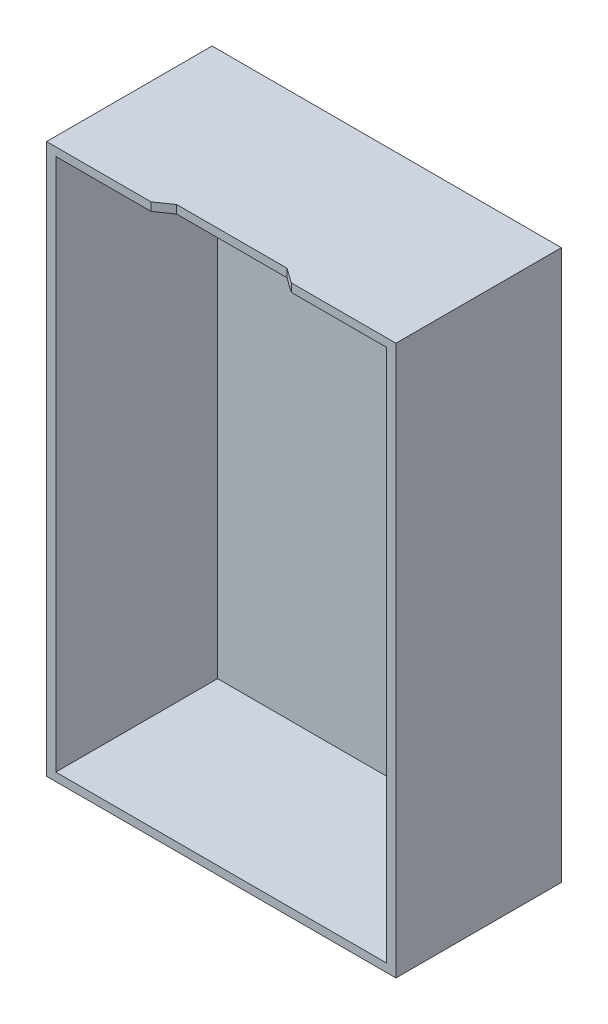
ISO-10303-21;
HEADER;
FILE_DESCRIPTION(('STEP AP214'),'2;1');
FILE_NAME('part.step','',(''),(''),'','','');
FILE_SCHEMA(('AUTOMOTIVE_DESIGN { 1 0 10303 214 1 1 1 1 }'));
ENDSEC;
DATA;
#1=APPLICATION_CONTEXT('core data for automotive mechanical design processes');
#2=APPLICATION_PROTOCOL_DEFINITION('international standard','automotive_design',2000,#1);
#3=PRODUCT_CONTEXT('',#1,'mechanical');
#4=PRODUCT('Part','Part','',(#3));
#5=PRODUCT_RELATED_PRODUCT_CATEGORY('part','',(#4));
#6=PRODUCT_DEFINITION_FORMATION('','',#4);
#7=PRODUCT_DEFINITION_CONTEXT('part definition',#1,'design');
#8=PRODUCT_DEFINITION('design','',#6,#7);
#9=PRODUCT_DEFINITION_SHAPE('','',#8);
#10=(LENGTH_UNIT() NAMED_UNIT(*) SI_UNIT(.MILLI.,.METRE.));
#11=(NAMED_UNIT(*) PLANE_ANGLE_UNIT() SI_UNIT($,.RADIAN.));
#12=(NAMED_UNIT(*) SI_UNIT($,.STERADIAN.) SOLID_ANGLE_UNIT());
#13=UNCERTAINTY_MEASURE_WITH_UNIT(LENGTH_MEASURE(1.E-05),#10,'distance_accuracy_value','');
#14=(GEOMETRIC_REPRESENTATION_CONTEXT(3) GLOBAL_UNCERTAINTY_ASSIGNED_CONTEXT((#13)) GLOBAL_UNIT_ASSIGNED_CONTEXT((#10,
#11,#12)) REPRESENTATION_CONTEXT('',''));
#15=CARTESIAN_POINT('',(0.,0.,0.));
#16=DIRECTION('',(0.,0.,1.));
#17=DIRECTION('',(1.,0.,0.));
#18=AXIS2_PLACEMENT_3D('',#15,#16,#17);
#19=CARTESIAN_POINT('',(120.65,379.73,-57.15));
#20=DIRECTION('',(-1.,0.,0.));
#21=DIRECTION('',(0.,0.,1.));
#22=AXIS2_PLACEMENT_3D('',#19,#20,#21);
#23=PLANE('',#22);
#24=DIRECTION('',(0.,0.,-1.));
#25=VECTOR('',#24,1.);
#26=CARTESIAN_POINT('',(120.65,0.,-57.15));
#27=LINE('',#26,#25);
#28=CARTESIAN_POINT('',(120.65,0.,57.15));
#29=VERTEX_POINT('',#28);
#30=CARTESIAN_POINT('',(120.65,0.,-57.15));
#31=VERTEX_POINT('',#30);
#32=EDGE_CURVE('E166',#29,#31,#27,.T.);
#33=ORIENTED_EDGE('',*,*,#32,.T.);
#34=DIRECTION('',(0.,-1.,0.));
#35=VECTOR('',#34,1.);
#36=CARTESIAN_POINT('',(120.65,379.73,-57.15));
#37=LINE('',#36,#35);
#38=CARTESIAN_POINT('',(120.65,379.73,-57.15));
#39=VERTEX_POINT('',#38);
#40=EDGE_CURVE('E191',#39,#31,#37,.T.);
#41=ORIENTED_EDGE('',*,*,#40,.F.);
#42=DIRECTION('',(0.,0.,-1.));
#43=VECTOR('',#42,1.);
#44=CARTESIAN_POINT('',(120.65,379.73,-57.15));
#45=LINE('',#44,#43);
#46=CARTESIAN_POINT('',(120.65,379.73,57.15));
#47=VERTEX_POINT('',#46);
#48=EDGE_CURVE('E180',#47,#39,#45,.T.);
#49=ORIENTED_EDGE('',*,*,#48,.F.);
#50=DIRECTION('',(0.,-1.,0.));
#51=VECTOR('',#50,1.);
#52=CARTESIAN_POINT('',(120.65,379.73,57.15));
#53=LINE('',#52,#51);
#54=EDGE_CURVE('E153',#47,#29,#53,.T.);
#55=ORIENTED_EDGE('',*,*,#54,.T.);
#56=EDGE_LOOP('',(#33,#41,#49,#55));
#57=FACE_BOUND('',#56,.T.);
#58=ADVANCED_FACE('F39',(#57),#23,.F.);
#59=CARTESIAN_POINT('',(-120.65,379.73,-57.15));
#60=DIRECTION('',(0.,0.,1.));
#61=DIRECTION('',(1.,0.,0.));
#62=AXIS2_PLACEMENT_3D('',#59,#60,#61);
#63=PLANE('',#62);
#64=DIRECTION('',(-1.,0.,0.));
#65=VECTOR('',#64,1.);
#66=CARTESIAN_POINT('',(-120.65,0.,-57.15));
#67=LINE('',#66,#65);
#68=CARTESIAN_POINT('',(-120.65,0.,-57.15));
#69=VERTEX_POINT('',#68);
#70=EDGE_CURVE('E170',#31,#69,#67,.T.);
#71=ORIENTED_EDGE('',*,*,#70,.T.);
#72=DIRECTION('',(0.,-1.,0.));
#73=VECTOR('',#72,1.);
#74=CARTESIAN_POINT('',(-120.65,379.73,-57.15));
#75=LINE('',#74,#73);
#76=CARTESIAN_POINT('',(-120.65,379.73,-57.15));
#77=VERTEX_POINT('',#76);
#78=EDGE_CURVE('E187',#77,#69,#75,.T.);
#79=ORIENTED_EDGE('',*,*,#78,.F.);
#80=DIRECTION('',(-1.,0.,0.));
#81=VECTOR('',#80,1.);
#82=CARTESIAN_POINT('',(-120.65,379.73,-57.15));
#83=LINE('',#82,#81);
#84=EDGE_CURVE('E162',#39,#77,#83,.T.);
#85=ORIENTED_EDGE('',*,*,#84,.F.);
#86=ORIENTED_EDGE('',*,*,#40,.T.);
#87=EDGE_LOOP('',(#71,#79,#85,#86));
#88=FACE_BOUND('',#87,.T.);
#89=ADVANCED_FACE('F264',(#88),#63,.F.);
#90=CARTESIAN_POINT('',(-120.65,379.73,-57.15));
#91=DIRECTION('',(1.,0.,0.));
#92=DIRECTION('',(0.,0.,-1.));
#93=AXIS2_PLACEMENT_3D('',#90,#91,#92);
#94=PLANE('',#93);
#95=DIRECTION('',(0.,0.,1.));
#96=VECTOR('',#95,1.);
#97=CARTESIAN_POINT('',(-120.65,0.,-57.15));
#98=LINE('',#97,#96);
#99=CARTESIAN_POINT('',(-120.65,0.,57.15));
#100=VERTEX_POINT('',#99);
#101=EDGE_CURVE('E174',#69,#100,#98,.T.);
#102=ORIENTED_EDGE('',*,*,#101,.T.);
#103=DIRECTION('',(0.,-1.,0.));
#104=VECTOR('',#103,1.);
#105=CARTESIAN_POINT('',(-120.65,379.73,57.15));
#106=LINE('',#105,#104);
#107=CARTESIAN_POINT('',(-120.65,379.73,57.15));
#108=VERTEX_POINT('',#107);
#109=EDGE_CURVE('E183',#108,#100,#106,.T.);
#110=ORIENTED_EDGE('',*,*,#109,.F.);
#111=DIRECTION('',(0.,0.,1.));
#112=VECTOR('',#111,1.);
#113=CARTESIAN_POINT('',(-120.65,379.73,-57.15));
#114=LINE('',#113,#112);
#115=EDGE_CURVE('E157',#77,#108,#114,.T.);
#116=ORIENTED_EDGE('',*,*,#115,.F.);
#117=ORIENTED_EDGE('',*,*,#78,.T.);
#118=EDGE_LOOP('',(#102,#110,#116,#117));
#119=FACE_BOUND('',#118,.T.);
#120=ADVANCED_FACE('F267',(#119),#94,.F.);
#121=CARTESIAN_POINT('',(-120.65,379.73,57.15));
#122=DIRECTION('',(0.,0.,-1.));
#123=DIRECTION('',(-1.,0.,0.));
#124=AXIS2_PLACEMENT_3D('',#121,#122,#123);
#125=PLANE('',#124);
#126=DIRECTION('',(-1.,0.,0.));
#127=VECTOR('',#126,1.);
#128=CARTESIAN_POINT('',(-114.3,374.015,57.15));
#129=LINE('',#128,#127);
#130=CARTESIAN_POINT('',(-48.5109019290271,374.015,57.15));
#131=VERTEX_POINT('',#130);
#132=CARTESIAN_POINT('',(-114.3,374.015,57.15));
#133=VERTEX_POINT('',#132);
#134=EDGE_CURVE('E235',#131,#133,#129,.T.);
#135=ORIENTED_EDGE('',*,*,#134,.F.);
#136=DIRECTION('',(0.,1.,0.));
#137=VECTOR('',#136,1.);
#138=CARTESIAN_POINT('',(-48.5109019290271,267.97,57.15));
#139=LINE('',#138,#137);
#140=CARTESIAN_POINT('',(-48.5109019290271,379.73,57.15));
#141=VERTEX_POINT('',#140);
#142=EDGE_CURVE('E206',#131,#141,#139,.T.);
#143=ORIENTED_EDGE('',*,*,#142,.T.);
#144=DIRECTION('',(1.,0.,0.));
#145=VECTOR('',#144,1.);
#146=CARTESIAN_POINT('',(-120.65,379.73,57.15));
#147=LINE('',#146,#145);
#148=EDGE_CURVE('E156',#108,#141,#147,.T.);
#149=ORIENTED_EDGE('',*,*,#148,.F.);
#150=ORIENTED_EDGE('',*,*,#109,.T.);
#151=DIRECTION('',(1.,0.,0.));
#152=VECTOR('',#151,1.);
#153=CARTESIAN_POINT('',(-120.65,0.,57.15));
#154=LINE('',#153,#152);
#155=EDGE_CURVE('E177',#100,#29,#154,.T.);
#156=ORIENTED_EDGE('',*,*,#155,.T.);
#157=ORIENTED_EDGE('',*,*,#54,.F.);
#158=CARTESIAN_POINT('',(48.3847974942099,379.73,57.15));
#159=VERTEX_POINT('',#158);
#160=EDGE_CURVE('E144',#159,#47,#147,.T.);
#161=ORIENTED_EDGE('',*,*,#160,.F.);
#162=DIRECTION('',(0.,1.,0.));
#163=VECTOR('',#162,1.);
#164=CARTESIAN_POINT('',(48.3847974942099,267.97,57.15));
#165=LINE('',#164,#163);
#166=CARTESIAN_POINT('',(48.3847974942099,374.015,57.15));
#167=VERTEX_POINT('',#166);
#168=EDGE_CURVE('E126',#167,#159,#165,.T.);
#169=ORIENTED_EDGE('',*,*,#168,.F.);
#170=CARTESIAN_POINT('',(114.3,374.015,57.15));
#171=VERTEX_POINT('',#170);
#172=EDGE_CURVE('E236',#171,#167,#129,.T.);
#173=ORIENTED_EDGE('',*,*,#172,.F.);
#174=DIRECTION('',(0.,1.,0.));
#175=VECTOR('',#174,1.);
#176=CARTESIAN_POINT('',(114.3,374.015,57.15));
#177=LINE('',#176,#175);
#178=CARTESIAN_POINT('',(114.3,5.71499999999994,57.15));
#179=VERTEX_POINT('',#178);
#180=EDGE_CURVE('E62',#179,#171,#177,.T.);
#181=ORIENTED_EDGE('',*,*,#180,.F.);
#182=DIRECTION('',(1.,0.,0.));
#183=VECTOR('',#182,1.);
#184=CARTESIAN_POINT('',(-114.3,5.71499999999994,57.15));
#185=LINE('',#184,#183);
#186=CARTESIAN_POINT('',(-114.3,5.71499999999994,57.15));
#187=VERTEX_POINT('',#186);
#188=EDGE_CURVE('E220',#187,#179,#185,.T.);
#189=ORIENTED_EDGE('',*,*,#188,.F.);
#190=DIRECTION('',(0.,-1.,0.));
#191=VECTOR('',#190,1.);
#192=CARTESIAN_POINT('',(-114.3,374.015,57.15));
#193=LINE('',#192,#191);
#194=EDGE_CURVE('E239',#133,#187,#193,.T.);
#195=ORIENTED_EDGE('',*,*,#194,.F.);
#196=EDGE_LOOP('',(#135,#143,#149,#150,#156,#157,#161,#169,#173,#181,#189,#195));
#197=FACE_BOUND('',#196,.T.);
#198=ADVANCED_FACE('F151',(#197),#125,.F.);
#199=CARTESIAN_POINT('',(0.,379.73,0.));
#200=DIRECTION('',(0.,1.,0.));
#201=DIRECTION('',(0.,0.,1.));
#202=AXIS2_PLACEMENT_3D('',#199,#200,#201);
#203=PLANE('',#202);
#204=DIRECTION('',(-0.820017177488627,0.,0.57233891063214));
#205=VECTOR('',#204,1.);
#206=CARTESIAN_POINT('',(-38.1,379.73,49.883610426301));
#207=LINE('',#206,#205);
#208=CARTESIAN_POINT('',(-38.1,379.73,49.883610426301));
#209=VERTEX_POINT('',#208);
#210=EDGE_CURVE('E138',#209,#141,#207,.T.);
#211=ORIENTED_EDGE('',*,*,#210,.F.);
#212=DIRECTION('',(-1.,0.,0.));
#213=VECTOR('',#212,1.);
#214=CARTESIAN_POINT('',(-38.1,379.73,49.883610426301));
#215=LINE('',#214,#213);
#216=CARTESIAN_POINT('',(38.1,379.73,49.883610426301));
#217=VERTEX_POINT('',#216);
#218=EDGE_CURVE('E147',#217,#209,#215,.T.);
#219=ORIENTED_EDGE('',*,*,#218,.F.);
#220=DIRECTION('',(-0.816723389336164,0.,-0.577029379937667));
#221=VECTOR('',#220,1.);
#222=CARTESIAN_POINT('',(38.1,379.73,49.883610426301));
#223=LINE('',#222,#221);
#224=EDGE_CURVE('E129',#159,#217,#223,.T.);
#225=ORIENTED_EDGE('',*,*,#224,.F.);
#226=ORIENTED_EDGE('',*,*,#160,.T.);
#227=ORIENTED_EDGE('',*,*,#48,.T.);
#228=ORIENTED_EDGE('',*,*,#84,.T.);
#229=ORIENTED_EDGE('',*,*,#115,.T.);
#230=ORIENTED_EDGE('',*,*,#148,.T.);
#231=EDGE_LOOP('',(#211,#219,#225,#226,#227,#228,#229,#230));
#232=FACE_BOUND('',#231,.T.);
#233=ADVANCED_FACE('F142',(#232),#203,.T.);
#234=CARTESIAN_POINT('',(0.,0.,0.));
#235=DIRECTION('',(0.,1.,0.));
#236=DIRECTION('',(0.,0.,1.));
#237=AXIS2_PLACEMENT_3D('',#234,#235,#236);
#238=PLANE('',#237);
#239=ORIENTED_EDGE('',*,*,#32,.F.);
#240=ORIENTED_EDGE('',*,*,#155,.F.);
#241=ORIENTED_EDGE('',*,*,#101,.F.);
#242=ORIENTED_EDGE('',*,*,#70,.F.);
#243=EDGE_LOOP('',(#239,#240,#241,#242));
#244=FACE_BOUND('',#243,.T.);
#245=ADVANCED_FACE('F291',(#244),#238,.F.);
#246=CARTESIAN_POINT('',(114.3,374.015,-54.6100000000001));
#247=DIRECTION('',(1.,0.,0.));
#248=DIRECTION('',(0.,1.,0.));
#249=AXIS2_PLACEMENT_3D('',#246,#247,#248);
#250=PLANE('',#249);
#251=ORIENTED_EDGE('',*,*,#180,.T.);
#252=DIRECTION('',(0.,0.,1.));
#253=VECTOR('',#252,1.);
#254=CARTESIAN_POINT('',(114.3,374.015,-54.6100000000001));
#255=LINE('',#254,#253);
#256=CARTESIAN_POINT('',(114.3,374.015,-54.6100000000001));
#257=VERTEX_POINT('',#256);
#258=EDGE_CURVE('E232',#257,#171,#255,.T.);
#259=ORIENTED_EDGE('',*,*,#258,.F.);
#260=DIRECTION('',(0.,1.,0.));
#261=VECTOR('',#260,1.);
#262=CARTESIAN_POINT('',(114.3,374.015,-54.6100000000001));
#263=LINE('',#262,#261);
#264=CARTESIAN_POINT('',(114.3,5.71499999999994,-54.6100000000001));
#265=VERTEX_POINT('',#264);
#266=EDGE_CURVE('E215',#265,#257,#263,.T.);
#267=ORIENTED_EDGE('',*,*,#266,.F.);
#268=DIRECTION('',(0.,0.,1.));
#269=VECTOR('',#268,1.);
#270=CARTESIAN_POINT('',(114.3,5.71499999999994,-54.6100000000001));
#271=LINE('',#270,#269);
#272=EDGE_CURVE('E171',#265,#179,#271,.T.);
#273=ORIENTED_EDGE('',*,*,#272,.T.);
#274=EDGE_LOOP('',(#251,#259,#267,#273));
#275=FACE_BOUND('',#274,.T.);
#276=ADVANCED_FACE('F293',(#275),#250,.F.);
#277=CARTESIAN_POINT('',(-114.3,5.71499999999994,-54.6100000000001));
#278=DIRECTION('',(0.,-1.,0.));
#279=DIRECTION('',(0.,0.,-1.));
#280=AXIS2_PLACEMENT_3D('',#277,#278,#279);
#281=PLANE('',#280);
#282=ORIENTED_EDGE('',*,*,#188,.T.);
#283=ORIENTED_EDGE('',*,*,#272,.F.);
#284=DIRECTION('',(1.,0.,0.));
#285=VECTOR('',#284,1.);
#286=CARTESIAN_POINT('',(-114.3,5.71499999999994,-54.6100000000001));
#287=LINE('',#286,#285);
#288=CARTESIAN_POINT('',(-114.3,5.71499999999994,-54.6100000000001));
#289=VERTEX_POINT('',#288);
#290=EDGE_CURVE('E228',#289,#265,#287,.T.);
#291=ORIENTED_EDGE('',*,*,#290,.F.);
#292=DIRECTION('',(0.,0.,1.));
#293=VECTOR('',#292,1.);
#294=CARTESIAN_POINT('',(-114.3,5.71499999999994,-54.6100000000001));
#295=LINE('',#294,#293);
#296=EDGE_CURVE('E248',#289,#187,#295,.T.);
#297=ORIENTED_EDGE('',*,*,#296,.T.);
#298=EDGE_LOOP('',(#282,#283,#291,#297));
#299=FACE_BOUND('',#298,.T.);
#300=ADVANCED_FACE('F299',(#299),#281,.F.);
#301=CARTESIAN_POINT('',(-114.3,374.015,-54.6100000000001));
#302=DIRECTION('',(-1.,0.,0.));
#303=DIRECTION('',(0.,-1.,0.));
#304=AXIS2_PLACEMENT_3D('',#301,#302,#303);
#305=PLANE('',#304);
#306=ORIENTED_EDGE('',*,*,#194,.T.);
#307=ORIENTED_EDGE('',*,*,#296,.F.);
#308=DIRECTION('',(0.,-1.,0.));
#309=VECTOR('',#308,1.);
#310=CARTESIAN_POINT('',(-114.3,374.015,-54.6100000000001));
#311=LINE('',#310,#309);
#312=CARTESIAN_POINT('',(-114.3,374.015,-54.6100000000001));
#313=VERTEX_POINT('',#312);
#314=EDGE_CURVE('E224',#313,#289,#311,.T.);
#315=ORIENTED_EDGE('',*,*,#314,.F.);
#316=DIRECTION('',(0.,0.,1.));
#317=VECTOR('',#316,1.);
#318=CARTESIAN_POINT('',(-114.3,374.015,-54.6100000000001));
#319=LINE('',#318,#317);
#320=EDGE_CURVE('E251',#313,#133,#319,.T.);
#321=ORIENTED_EDGE('',*,*,#320,.T.);
#322=EDGE_LOOP('',(#306,#307,#315,#321));
#323=FACE_BOUND('',#322,.T.);
#324=ADVANCED_FACE('F328',(#323),#305,.F.);
#325=CARTESIAN_POINT('',(-114.3,374.015,-54.6100000000001));
#326=DIRECTION('',(0.,1.,0.));
#327=DIRECTION('',(0.,0.,1.));
#328=AXIS2_PLACEMENT_3D('',#325,#326,#327);
#329=PLANE('',#328);
#330=DIRECTION('',(-1.,0.,0.));
#331=VECTOR('',#330,1.);
#332=CARTESIAN_POINT('',(-114.3,374.015,49.8836104263011));
#333=LINE('',#332,#331);
#334=CARTESIAN_POINT('',(38.1,374.015,49.883610426301));
#335=VERTEX_POINT('',#334);
#336=CARTESIAN_POINT('',(-38.1,374.015,49.883610426301));
#337=VERTEX_POINT('',#336);
#338=EDGE_CURVE('E47',#335,#337,#333,.T.);
#339=ORIENTED_EDGE('',*,*,#338,.T.);
#340=DIRECTION('',(-0.820017177488628,0.,0.57233891063214));
#341=VECTOR('',#340,1.);
#342=CARTESIAN_POINT('',(-40.2972768354201,374.015,51.4172210199145));
#343=LINE('',#342,#341);
#344=EDGE_CURVE('E11',#337,#131,#343,.T.);
#345=ORIENTED_EDGE('',*,*,#344,.T.);
#346=ORIENTED_EDGE('',*,*,#134,.T.);
#347=ORIENTED_EDGE('',*,*,#320,.F.);
#348=DIRECTION('',(-1.,0.,0.));
#349=VECTOR('',#348,1.);
#350=CARTESIAN_POINT('',(-114.3,374.015,-54.6100000000001));
#351=LINE('',#350,#349);
#352=EDGE_CURVE('E219',#257,#313,#351,.T.);
#353=ORIENTED_EDGE('',*,*,#352,.F.);
#354=ORIENTED_EDGE('',*,*,#258,.T.);
#355=ORIENTED_EDGE('',*,*,#172,.T.);
#356=DIRECTION('',(-0.816723389336164,0.,-0.577029379937667));
#357=VECTOR('',#356,1.);
#358=CARTESIAN_POINT('',(-112.801511346607,374.015,-56.7309504653176));
#359=LINE('',#358,#357);
#360=EDGE_CURVE('E132',#167,#335,#359,.T.);
#361=ORIENTED_EDGE('',*,*,#360,.T.);
#362=EDGE_LOOP('',(#339,#345,#346,#347,#353,#354,#355,#361));
#363=FACE_BOUND('',#362,.T.);
#364=ADVANCED_FACE('F199',(#363),#329,.F.);
#365=CARTESIAN_POINT('',(0.,0.,-54.6100000000001));
#366=DIRECTION('',(0.,0.,1.));
#367=DIRECTION('',(1.,0.,0.));
#368=AXIS2_PLACEMENT_3D('',#365,#366,#367);
#369=PLANE('',#368);
#370=ORIENTED_EDGE('',*,*,#266,.T.);
#371=ORIENTED_EDGE('',*,*,#352,.T.);
#372=ORIENTED_EDGE('',*,*,#314,.T.);
#373=ORIENTED_EDGE('',*,*,#290,.T.);
#374=EDGE_LOOP('',(#370,#371,#372,#373));
#375=FACE_BOUND('',#374,.T.);
#376=ADVANCED_FACE('F275',(#375),#369,.T.);
#377=CARTESIAN_POINT('',(-38.1,267.97,49.883610426301));
#378=DIRECTION('',(-0.57233891063214,0.,-0.820017177488627));
#379=DIRECTION('',(-0.820017177488628,0.,0.57233891063214));
#380=AXIS2_PLACEMENT_3D('',#377,#378,#379);
#381=PLANE('',#380);
#382=DIRECTION('',(0.,1.,0.));
#383=VECTOR('',#382,1.);
#384=CARTESIAN_POINT('',(-38.1,267.97,49.883610426301));
#385=LINE('',#384,#383);
#386=EDGE_CURVE('E203',#337,#209,#385,.T.);
#387=ORIENTED_EDGE('',*,*,#386,.T.);
#388=ORIENTED_EDGE('',*,*,#210,.T.);
#389=ORIENTED_EDGE('',*,*,#142,.F.);
#390=ORIENTED_EDGE('',*,*,#344,.F.);
#391=EDGE_LOOP('',(#387,#388,#389,#390));
#392=FACE_BOUND('',#391,.T.);
#393=ADVANCED_FACE('F273',(#392),#381,.F.);
#394=CARTESIAN_POINT('',(-38.1,267.97,49.883610426301));
#395=DIRECTION('',(0.,0.,-1.));
#396=DIRECTION('',(-1.,0.,0.));
#397=AXIS2_PLACEMENT_3D('',#394,#395,#396);
#398=PLANE('',#397);
#399=DIRECTION('',(0.,1.,0.));
#400=VECTOR('',#399,1.);
#401=CARTESIAN_POINT('',(38.1,267.97,49.883610426301));
#402=LINE('',#401,#400);
#403=EDGE_CURVE('E54',#335,#217,#402,.T.);
#404=ORIENTED_EDGE('',*,*,#403,.T.);
#405=ORIENTED_EDGE('',*,*,#218,.T.);
#406=ORIENTED_EDGE('',*,*,#386,.F.);
#407=ORIENTED_EDGE('',*,*,#338,.F.);
#408=EDGE_LOOP('',(#404,#405,#406,#407));
#409=FACE_BOUND('',#408,.T.);
#410=ADVANCED_FACE('F202',(#409),#398,.F.);
#411=CARTESIAN_POINT('',(38.1,267.97,49.883610426301));
#412=DIRECTION('',(0.577029379937667,0.,-0.816723389336164));
#413=DIRECTION('',(-0.816723389336164,0.,-0.577029379937667));
#414=AXIS2_PLACEMENT_3D('',#411,#412,#413);
#415=PLANE('',#414);
#416=ORIENTED_EDGE('',*,*,#168,.T.);
#417=ORIENTED_EDGE('',*,*,#224,.T.);
#418=ORIENTED_EDGE('',*,*,#403,.F.);
#419=ORIENTED_EDGE('',*,*,#360,.F.);
#420=EDGE_LOOP('',(#416,#417,#418,#419));
#421=FACE_BOUND('',#420,.T.);
#422=ADVANCED_FACE('F128',(#421),#415,.F.);
#423=CLOSED_SHELL('',(#58,#89,#120,#198,#233,#245,#276,#300,#324,#364,#376,#393,#410,#422));
#424=MANIFOLD_SOLID_BREP('B2',#423);
#425=ADVANCED_BREP_SHAPE_REPRESENTATION('',(#18,#424),#14);
#426=SHAPE_DEFINITION_REPRESENTATION(#9,#425);
ENDSEC;
END-ISO-10303-21;
